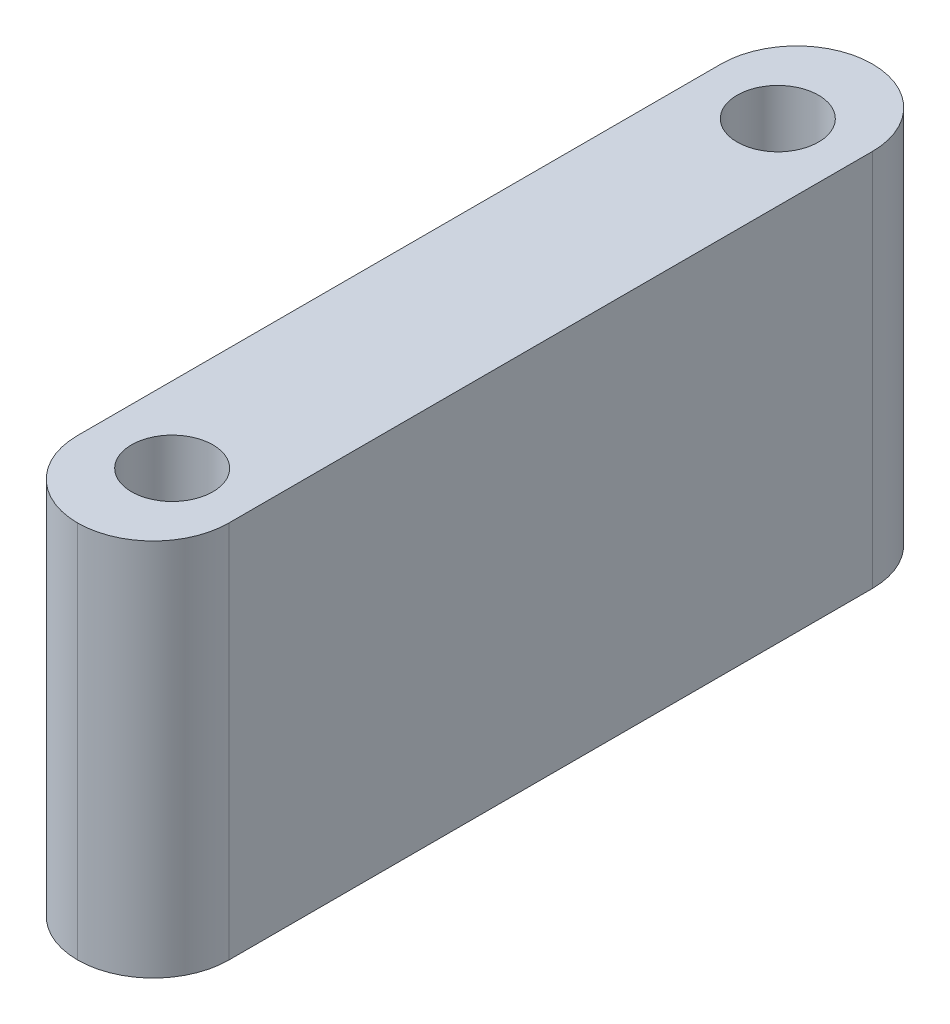
ISO-10303-21;
HEADER;
FILE_DESCRIPTION(('STEP AP214'),'2;1');
FILE_NAME('part.step','',(''),(''),'','','');
FILE_SCHEMA(('AUTOMOTIVE_DESIGN { 1 0 10303 214 1 1 1 1 }'));
ENDSEC;
DATA;
#1=APPLICATION_CONTEXT('core data for automotive mechanical design processes');
#2=APPLICATION_PROTOCOL_DEFINITION('international standard','automotive_design',2000,#1);
#3=PRODUCT_CONTEXT('',#1,'mechanical');
#4=PRODUCT('Part','Part','',(#3));
#5=PRODUCT_RELATED_PRODUCT_CATEGORY('part','',(#4));
#6=PRODUCT_DEFINITION_FORMATION('','',#4);
#7=PRODUCT_DEFINITION_CONTEXT('part definition',#1,'design');
#8=PRODUCT_DEFINITION('design','',#6,#7);
#9=PRODUCT_DEFINITION_SHAPE('','',#8);
#10=(LENGTH_UNIT() NAMED_UNIT(*) SI_UNIT(.MILLI.,.METRE.));
#11=(NAMED_UNIT(*) PLANE_ANGLE_UNIT() SI_UNIT($,.RADIAN.));
#12=(NAMED_UNIT(*) SI_UNIT($,.STERADIAN.) SOLID_ANGLE_UNIT());
#13=UNCERTAINTY_MEASURE_WITH_UNIT(LENGTH_MEASURE(1.E-05),#10,'distance_accuracy_value','');
#14=(GEOMETRIC_REPRESENTATION_CONTEXT(3) GLOBAL_UNCERTAINTY_ASSIGNED_CONTEXT((#13)) GLOBAL_UNIT_ASSIGNED_CONTEXT((#10,
#11,#12)) REPRESENTATION_CONTEXT('',''));
#15=CARTESIAN_POINT('',(0.,0.,0.));
#16=DIRECTION('',(0.,0.,1.));
#17=DIRECTION('',(1.,0.,0.));
#18=AXIS2_PLACEMENT_3D('',#15,#16,#17);
#19=CARTESIAN_POINT('',(0.,20.,0.));
#20=DIRECTION('',(0.,1.,0.));
#21=DIRECTION('',(0.,0.,1.));
#22=AXIS2_PLACEMENT_3D('',#19,#20,#21);
#23=PLANE('',#22);
#24=CARTESIAN_POINT('',(-4.,20.,-37.));
#25=DIRECTION('',(0.,1.,0.));
#26=DIRECTION('',(0.,0.,1.));
#27=AXIS2_PLACEMENT_3D('',#24,#25,#26);
#28=CIRCLE('',#27,2.15);
#29=CARTESIAN_POINT('',(-4.,20.,-34.85));
#30=VERTEX_POINT('',#29);
#31=EDGE_CURVE('E132',#30,#30,#28,.T.);
#32=ORIENTED_EDGE('',*,*,#31,.F.);
#33=EDGE_LOOP('',(#32));
#34=FACE_BOUND('',#33,.T.);
#35=CARTESIAN_POINT('',(-4.,20.,-38.));
#36=DIRECTION('',(0.,1.,0.));
#37=DIRECTION('',(0.,0.,1.));
#38=AXIS2_PLACEMENT_3D('',#35,#36,#37);
#39=CIRCLE('',#38,4.);
#40=CARTESIAN_POINT('',(0.,20.,-38.));
#41=VERTEX_POINT('',#40);
#42=CARTESIAN_POINT('',(-4.,20.,-42.));
#43=VERTEX_POINT('',#42);
#44=EDGE_CURVE('E158',#41,#43,#39,.T.);
#45=ORIENTED_EDGE('',*,*,#44,.T.);
#46=CARTESIAN_POINT('',(-4.00000000000001,20.,-38.));
#47=DIRECTION('',(0.,1.,0.));
#48=DIRECTION('',(0.,0.,1.));
#49=AXIS2_PLACEMENT_3D('',#46,#47,#48);
#50=CIRCLE('',#49,4.);
#51=CARTESIAN_POINT('',(-8.00000000000001,20.,-38.));
#52=VERTEX_POINT('',#51);
#53=EDGE_CURVE('E161',#43,#52,#50,.T.);
#54=ORIENTED_EDGE('',*,*,#53,.T.);
#55=DIRECTION('',(0.,0.,1.));
#56=VECTOR('',#55,1.);
#57=CARTESIAN_POINT('',(-8.00000000000001,20.,0.));
#58=LINE('',#57,#56);
#59=CARTESIAN_POINT('',(-8.00000000000001,20.,-4.));
#60=VERTEX_POINT('',#59);
#61=EDGE_CURVE('E141',#52,#60,#58,.T.);
#62=ORIENTED_EDGE('',*,*,#61,.T.);
#63=CARTESIAN_POINT('',(-4.00000000000001,20.,-4.));
#64=DIRECTION('',(0.,1.,0.));
#65=DIRECTION('',(0.,0.,1.));
#66=AXIS2_PLACEMENT_3D('',#63,#64,#65);
#67=CIRCLE('',#66,4.);
#68=CARTESIAN_POINT('',(-4.00000000000001,20.,0.));
#69=VERTEX_POINT('',#68);
#70=EDGE_CURVE('E63',#60,#69,#67,.T.);
#71=ORIENTED_EDGE('',*,*,#70,.T.);
#72=CARTESIAN_POINT('',(-4.,20.,-4.));
#73=DIRECTION('',(0.,1.,0.));
#74=DIRECTION('',(0.,0.,1.));
#75=AXIS2_PLACEMENT_3D('',#72,#73,#74);
#76=CIRCLE('',#75,4.);
#77=CARTESIAN_POINT('',(0.,20.,-4.));
#78=VERTEX_POINT('',#77);
#79=EDGE_CURVE('E155',#69,#78,#76,.T.);
#80=ORIENTED_EDGE('',*,*,#79,.T.);
#81=DIRECTION('',(0.,0.,-1.));
#82=VECTOR('',#81,1.);
#83=CARTESIAN_POINT('',(0.,20.,0.));
#84=LINE('',#83,#82);
#85=EDGE_CURVE('E122',#78,#41,#84,.T.);
#86=ORIENTED_EDGE('',*,*,#85,.T.);
#87=EDGE_LOOP('',(#45,#54,#62,#71,#80,#86));
#88=FACE_BOUND('',#87,.T.);
#89=CARTESIAN_POINT('',(-4.,20.,-5.));
#90=DIRECTION('',(0.,1.,0.));
#91=DIRECTION('',(0.,0.,-1.));
#92=AXIS2_PLACEMENT_3D('',#89,#90,#91);
#93=CIRCLE('',#92,2.15);
#94=CARTESIAN_POINT('',(-4.,20.,-7.15));
#95=VERTEX_POINT('',#94);
#96=EDGE_CURVE('E170',#95,#95,#93,.T.);
#97=ORIENTED_EDGE('',*,*,#96,.F.);
#98=EDGE_LOOP('',(#97));
#99=FACE_BOUND('',#98,.T.);
#100=ADVANCED_FACE('F45',(#34,#88,#99),#23,.T.);
#101=CARTESIAN_POINT('',(0.,0.,0.));
#102=DIRECTION('',(0.,1.,0.));
#103=DIRECTION('',(0.,0.,1.));
#104=AXIS2_PLACEMENT_3D('',#101,#102,#103);
#105=PLANE('',#104);
#106=DIRECTION('',(0.,0.,1.));
#107=VECTOR('',#106,1.);
#108=CARTESIAN_POINT('',(-8.00000000000001,0.,0.));
#109=LINE('',#108,#107);
#110=CARTESIAN_POINT('',(-8.00000000000001,0.,-38.));
#111=VERTEX_POINT('',#110);
#112=CARTESIAN_POINT('',(-8.00000000000001,0.,-4.));
#113=VERTEX_POINT('',#112);
#114=EDGE_CURVE('E131',#111,#113,#109,.T.);
#115=ORIENTED_EDGE('',*,*,#114,.F.);
#116=CARTESIAN_POINT('',(-4.00000000000001,0.,-38.));
#117=DIRECTION('',(0.,1.,0.));
#118=DIRECTION('',(0.,0.,1.));
#119=AXIS2_PLACEMENT_3D('',#116,#117,#118);
#120=CIRCLE('',#119,4.);
#121=CARTESIAN_POINT('',(-4.,0.,-42.));
#122=VERTEX_POINT('',#121);
#123=EDGE_CURVE('E150',#111,#122,#120,.F.);
#124=ORIENTED_EDGE('',*,*,#123,.T.);
#125=CARTESIAN_POINT('',(-4.,0.,-38.));
#126=DIRECTION('',(0.,1.,0.));
#127=DIRECTION('',(0.,0.,1.));
#128=AXIS2_PLACEMENT_3D('',#125,#126,#127);
#129=CIRCLE('',#128,4.);
#130=CARTESIAN_POINT('',(0.,0.,-38.));
#131=VERTEX_POINT('',#130);
#132=EDGE_CURVE('E112',#122,#131,#129,.F.);
#133=ORIENTED_EDGE('',*,*,#132,.T.);
#134=DIRECTION('',(0.,0.,-1.));
#135=VECTOR('',#134,1.);
#136=CARTESIAN_POINT('',(0.,0.,0.));
#137=LINE('',#136,#135);
#138=CARTESIAN_POINT('',(0.,0.,-4.));
#139=VERTEX_POINT('',#138);
#140=EDGE_CURVE('E119',#139,#131,#137,.T.);
#141=ORIENTED_EDGE('',*,*,#140,.F.);
#142=CARTESIAN_POINT('',(-4.,0.,-4.));
#143=DIRECTION('',(0.,1.,0.));
#144=DIRECTION('',(0.,0.,1.));
#145=AXIS2_PLACEMENT_3D('',#142,#143,#144);
#146=CIRCLE('',#145,4.);
#147=CARTESIAN_POINT('',(-4.00000000000001,0.,0.));
#148=VERTEX_POINT('',#147);
#149=EDGE_CURVE('E102',#139,#148,#146,.F.);
#150=ORIENTED_EDGE('',*,*,#149,.T.);
#151=CARTESIAN_POINT('',(-4.00000000000001,0.,-4.));
#152=DIRECTION('',(0.,1.,0.));
#153=DIRECTION('',(0.,0.,1.));
#154=AXIS2_PLACEMENT_3D('',#151,#152,#153);
#155=CIRCLE('',#154,4.);
#156=EDGE_CURVE('E113',#148,#113,#155,.F.);
#157=ORIENTED_EDGE('',*,*,#156,.T.);
#158=EDGE_LOOP('',(#115,#124,#133,#141,#150,#157));
#159=FACE_BOUND('',#158,.T.);
#160=CARTESIAN_POINT('',(-4.,0.,-37.));
#161=DIRECTION('',(0.,1.,0.));
#162=DIRECTION('',(0.,0.,1.));
#163=AXIS2_PLACEMENT_3D('',#160,#161,#162);
#164=CIRCLE('',#163,2.15);
#165=CARTESIAN_POINT('',(-4.,0.,-34.85));
#166=VERTEX_POINT('',#165);
#167=EDGE_CURVE('E138',#166,#166,#164,.T.);
#168=ORIENTED_EDGE('',*,*,#167,.T.);
#169=EDGE_LOOP('',(#168));
#170=FACE_BOUND('',#169,.T.);
#171=CARTESIAN_POINT('',(-4.,0.,-5.));
#172=DIRECTION('',(0.,1.,0.));
#173=DIRECTION('',(0.,0.,-1.));
#174=AXIS2_PLACEMENT_3D('',#171,#172,#173);
#175=CIRCLE('',#174,2.15);
#176=CARTESIAN_POINT('',(-4.,0.,-7.15));
#177=VERTEX_POINT('',#176);
#178=EDGE_CURVE('E166',#177,#177,#175,.T.);
#179=ORIENTED_EDGE('',*,*,#178,.T.);
#180=EDGE_LOOP('',(#179));
#181=FACE_BOUND('',#180,.T.);
#182=ADVANCED_FACE('F127',(#159,#170,#181),#105,.F.);
#183=CARTESIAN_POINT('',(0.,20.,0.));
#184=DIRECTION('',(-1.,0.,0.));
#185=DIRECTION('',(0.,0.,1.));
#186=AXIS2_PLACEMENT_3D('',#183,#184,#185);
#187=PLANE('',#186);
#188=ORIENTED_EDGE('',*,*,#85,.F.);
#189=DIRECTION('',(0.,-1.,0.));
#190=VECTOR('',#189,1.);
#191=CARTESIAN_POINT('',(0.,20.,-4.));
#192=LINE('',#191,#190);
#193=EDGE_CURVE('E106',#78,#139,#192,.T.);
#194=ORIENTED_EDGE('',*,*,#193,.T.);
#195=ORIENTED_EDGE('',*,*,#140,.T.);
#196=DIRECTION('',(0.,-1.,0.));
#197=VECTOR('',#196,1.);
#198=CARTESIAN_POINT('',(0.,20.,-38.));
#199=LINE('',#198,#197);
#200=EDGE_CURVE('E124',#131,#41,#199,.F.);
#201=ORIENTED_EDGE('',*,*,#200,.T.);
#202=EDGE_LOOP('',(#188,#194,#195,#201));
#203=FACE_BOUND('',#202,.T.);
#204=ADVANCED_FACE('F118',(#203),#187,.F.);
#205=CARTESIAN_POINT('',(-8.00000000000001,20.,0.));
#206=DIRECTION('',(1.,0.,0.));
#207=DIRECTION('',(0.,0.,-1.));
#208=AXIS2_PLACEMENT_3D('',#205,#206,#207);
#209=PLANE('',#208);
#210=ORIENTED_EDGE('',*,*,#61,.F.);
#211=DIRECTION('',(0.,-1.,0.));
#212=VECTOR('',#211,1.);
#213=CARTESIAN_POINT('',(-8.00000000000001,20.,-38.));
#214=LINE('',#213,#212);
#215=EDGE_CURVE('E11',#52,#111,#214,.T.);
#216=ORIENTED_EDGE('',*,*,#215,.T.);
#217=ORIENTED_EDGE('',*,*,#114,.T.);
#218=DIRECTION('',(0.,-1.,0.));
#219=VECTOR('',#218,1.);
#220=CARTESIAN_POINT('',(-8.00000000000001,20.,-4.));
#221=LINE('',#220,#219);
#222=EDGE_CURVE('E55',#113,#60,#221,.F.);
#223=ORIENTED_EDGE('',*,*,#222,.T.);
#224=EDGE_LOOP('',(#210,#216,#217,#223));
#225=FACE_BOUND('',#224,.T.);
#226=ADVANCED_FACE('F206',(#225),#209,.F.);
#227=CARTESIAN_POINT('',(-4.,20.,-37.));
#228=DIRECTION('',(0.,-1.,0.));
#229=DIRECTION('',(0.,0.,-1.));
#230=AXIS2_PLACEMENT_3D('',#227,#228,#229);
#231=CYLINDRICAL_SURFACE('',#230,2.15);
#232=ORIENTED_EDGE('',*,*,#31,.T.);
#233=EDGE_LOOP('',(#232));
#234=FACE_BOUND('',#233,.T.);
#235=ORIENTED_EDGE('',*,*,#167,.F.);
#236=EDGE_LOOP('',(#235));
#237=FACE_BOUND('',#236,.T.);
#238=ADVANCED_FACE('F203',(#234,#237),#231,.F.);
#239=CARTESIAN_POINT('',(-4.,20.,-5.));
#240=DIRECTION('',(0.,-1.,0.));
#241=DIRECTION('',(0.,0.,-1.));
#242=AXIS2_PLACEMENT_3D('',#239,#240,#241);
#243=CYLINDRICAL_SURFACE('',#242,2.15);
#244=ORIENTED_EDGE('',*,*,#96,.T.);
#245=EDGE_LOOP('',(#244));
#246=FACE_BOUND('',#245,.T.);
#247=ORIENTED_EDGE('',*,*,#178,.F.);
#248=EDGE_LOOP('',(#247));
#249=FACE_BOUND('',#248,.T.);
#250=ADVANCED_FACE('F191',(#246,#249),#243,.F.);
#251=CARTESIAN_POINT('',(-4.00000000000001,20.,-4.));
#252=DIRECTION('',(0.,-1.,0.));
#253=DIRECTION('',(0.,0.,-1.));
#254=AXIS2_PLACEMENT_3D('',#251,#252,#253);
#255=CYLINDRICAL_SURFACE('',#254,4.);
#256=DIRECTION('',(0.,-1.,0.));
#257=VECTOR('',#256,1.);
#258=CARTESIAN_POINT('',(-4.00000000000001,20.,0.));
#259=LINE('',#258,#257);
#260=EDGE_CURVE('E107',#69,#148,#259,.T.);
#261=ORIENTED_EDGE('',*,*,#260,.F.);
#262=ORIENTED_EDGE('',*,*,#70,.F.);
#263=ORIENTED_EDGE('',*,*,#222,.F.);
#264=ORIENTED_EDGE('',*,*,#156,.F.);
#265=EDGE_LOOP('',(#261,#262,#263,#264));
#266=FACE_BOUND('',#265,.T.);
#267=ADVANCED_FACE('F213',(#266),#255,.T.);
#268=CARTESIAN_POINT('',(-4.,20.,-4.));
#269=DIRECTION('',(0.,-1.,0.));
#270=DIRECTION('',(0.,0.,-1.));
#271=AXIS2_PLACEMENT_3D('',#268,#269,#270);
#272=CYLINDRICAL_SURFACE('',#271,4.);
#273=ORIENTED_EDGE('',*,*,#79,.F.);
#274=ORIENTED_EDGE('',*,*,#260,.T.);
#275=ORIENTED_EDGE('',*,*,#149,.F.);
#276=ORIENTED_EDGE('',*,*,#193,.F.);
#277=EDGE_LOOP('',(#273,#274,#275,#276));
#278=FACE_BOUND('',#277,.T.);
#279=ADVANCED_FACE('F105',(#278),#272,.T.);
#280=CARTESIAN_POINT('',(-4.,20.,-38.));
#281=DIRECTION('',(0.,-1.,0.));
#282=DIRECTION('',(0.,0.,-1.));
#283=AXIS2_PLACEMENT_3D('',#280,#281,#282);
#284=CYLINDRICAL_SURFACE('',#283,4.);
#285=DIRECTION('',(0.,-1.,0.));
#286=VECTOR('',#285,1.);
#287=CARTESIAN_POINT('',(-4.,20.,-42.));
#288=LINE('',#287,#286);
#289=EDGE_CURVE('E49',#43,#122,#288,.T.);
#290=ORIENTED_EDGE('',*,*,#289,.F.);
#291=ORIENTED_EDGE('',*,*,#44,.F.);
#292=ORIENTED_EDGE('',*,*,#200,.F.);
#293=ORIENTED_EDGE('',*,*,#132,.F.);
#294=EDGE_LOOP('',(#290,#291,#292,#293));
#295=FACE_BOUND('',#294,.T.);
#296=ADVANCED_FACE('F47',(#295),#284,.T.);
#297=CARTESIAN_POINT('',(-4.00000000000001,20.,-38.));
#298=DIRECTION('',(0.,-1.,0.));
#299=DIRECTION('',(0.,0.,-1.));
#300=AXIS2_PLACEMENT_3D('',#297,#298,#299);
#301=CYLINDRICAL_SURFACE('',#300,4.);
#302=ORIENTED_EDGE('',*,*,#53,.F.);
#303=ORIENTED_EDGE('',*,*,#289,.T.);
#304=ORIENTED_EDGE('',*,*,#123,.F.);
#305=ORIENTED_EDGE('',*,*,#215,.F.);
#306=EDGE_LOOP('',(#302,#303,#304,#305));
#307=FACE_BOUND('',#306,.T.);
#308=ADVANCED_FACE('F176',(#307),#301,.T.);
#309=CLOSED_SHELL('',(#100,#182,#204,#226,#238,#250,#267,#279,#296,#308));
#310=MANIFOLD_SOLID_BREP('B2',#309);
#311=ADVANCED_BREP_SHAPE_REPRESENTATION('',(#18,#310),#14);
#312=SHAPE_DEFINITION_REPRESENTATION(#9,#311);
ENDSEC;
END-ISO-10303-21;
